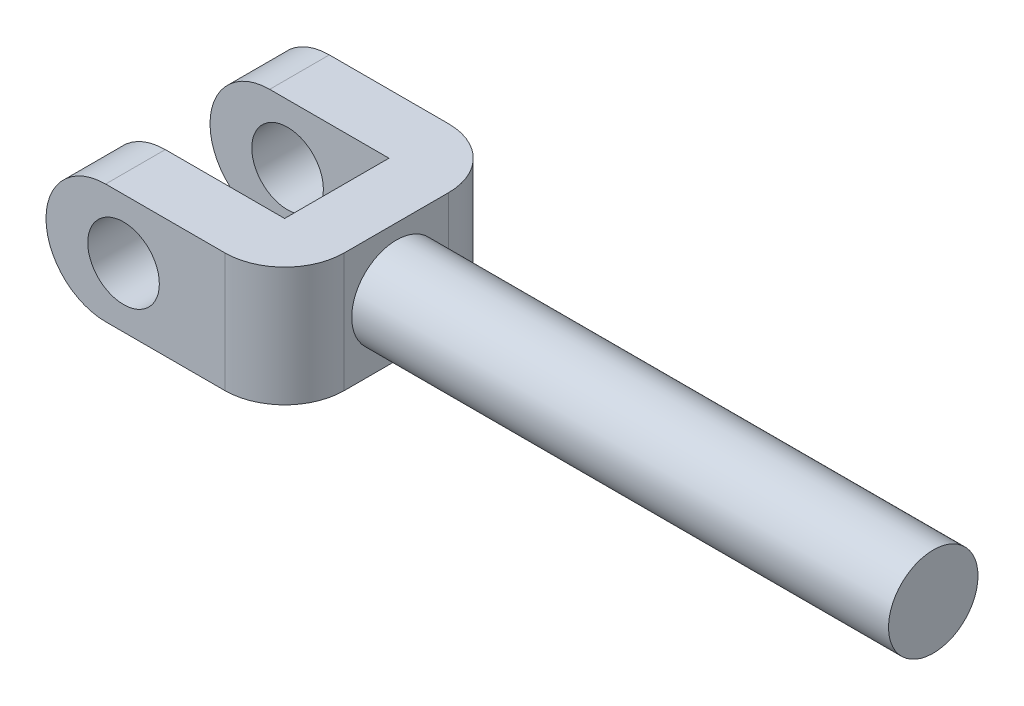
ISO-10303-21;
HEADER;
FILE_DESCRIPTION(('STEP AP214'),'2;1');
FILE_NAME('part.step','',(''),(''),'','','');
FILE_SCHEMA(('AUTOMOTIVE_DESIGN { 1 0 10303 214 1 1 1 1 }'));
ENDSEC;
DATA;
#1=APPLICATION_CONTEXT('core data for automotive mechanical design processes');
#2=APPLICATION_PROTOCOL_DEFINITION('international standard','automotive_design',2000,#1);
#3=PRODUCT_CONTEXT('',#1,'mechanical');
#4=PRODUCT('Part','Part','',(#3));
#5=PRODUCT_RELATED_PRODUCT_CATEGORY('part','',(#4));
#6=PRODUCT_DEFINITION_FORMATION('','',#4);
#7=PRODUCT_DEFINITION_CONTEXT('part definition',#1,'design');
#8=PRODUCT_DEFINITION('design','',#6,#7);
#9=PRODUCT_DEFINITION_SHAPE('','',#8);
#10=(LENGTH_UNIT() NAMED_UNIT(*) SI_UNIT(.MILLI.,.METRE.));
#11=(NAMED_UNIT(*) PLANE_ANGLE_UNIT() SI_UNIT($,.RADIAN.));
#12=(NAMED_UNIT(*) SI_UNIT($,.STERADIAN.) SOLID_ANGLE_UNIT());
#13=UNCERTAINTY_MEASURE_WITH_UNIT(LENGTH_MEASURE(1.E-05),#10,'distance_accuracy_value','');
#14=(GEOMETRIC_REPRESENTATION_CONTEXT(3) GLOBAL_UNCERTAINTY_ASSIGNED_CONTEXT((#13)) GLOBAL_UNIT_ASSIGNED_CONTEXT((#10,
#11,#12)) REPRESENTATION_CONTEXT('',''));
#15=CARTESIAN_POINT('',(0.,0.,0.));
#16=DIRECTION('',(0.,0.,1.));
#17=DIRECTION('',(1.,0.,0.));
#18=AXIS2_PLACEMENT_3D('',#15,#16,#17);
#19=CARTESIAN_POINT('',(10.,0.,0.));
#20=DIRECTION('',(-1.,0.,0.));
#21=DIRECTION('',(0.,0.,1.));
#22=AXIS2_PLACEMENT_3D('',#19,#20,#21);
#23=CYLINDRICAL_SURFACE('',#22,0.75);
#24=CARTESIAN_POINT('',(0.999999999999999,0.,0.));
#25=DIRECTION('',(1.,0.,0.));
#26=DIRECTION('',(0.,0.,-1.));
#27=AXIS2_PLACEMENT_3D('',#24,#25,#26);
#28=CIRCLE('',#27,0.75);
#29=CARTESIAN_POINT('',(0.999999999999999,0.,-0.75));
#30=VERTEX_POINT('',#29);
#31=EDGE_CURVE('E202',#30,#30,#28,.T.);
#32=ORIENTED_EDGE('',*,*,#31,.T.);
#33=EDGE_LOOP('',(#32));
#34=FACE_BOUND('',#33,.T.);
#35=CARTESIAN_POINT('',(10.,0.,0.));
#36=DIRECTION('',(1.,0.,0.));
#37=DIRECTION('',(0.,0.,-1.));
#38=AXIS2_PLACEMENT_3D('',#35,#36,#37);
#39=CIRCLE('',#38,0.75);
#40=CARTESIAN_POINT('',(10.,0.,-0.75));
#41=VERTEX_POINT('',#40);
#42=EDGE_CURVE('E204',#41,#41,#39,.T.);
#43=ORIENTED_EDGE('',*,*,#42,.F.);
#44=EDGE_LOOP('',(#43));
#45=FACE_BOUND('',#44,.T.);
#46=ADVANCED_FACE('F43',(#34,#45),#23,.T.);
#47=CARTESIAN_POINT('',(10.,0.,0.));
#48=DIRECTION('',(1.,0.,0.));
#49=DIRECTION('',(0.,0.,-1.));
#50=AXIS2_PLACEMENT_3D('',#47,#48,#49);
#51=PLANE('',#50);
#52=ORIENTED_EDGE('',*,*,#42,.T.);
#53=EDGE_LOOP('',(#52));
#54=FACE_BOUND('',#53,.T.);
#55=ADVANCED_FACE('F341',(#54),#51,.T.);
#56=CARTESIAN_POINT('',(0.,-1.,-0.875));
#57=DIRECTION('',(0.,0.,1.));
#58=DIRECTION('',(1.,0.,0.));
#59=AXIS2_PLACEMENT_3D('',#56,#57,#58);
#60=PLANE('',#59);
#61=CARTESIAN_POINT('',(-1.7,0.,-0.875));
#62=DIRECTION('',(0.,0.,1.));
#63=DIRECTION('',(1.,0.,0.));
#64=AXIS2_PLACEMENT_3D('',#61,#62,#63);
#65=CIRCLE('',#64,0.599999999999999);
#66=CARTESIAN_POINT('',(-1.1,0.,-0.875));
#67=VERTEX_POINT('',#66);
#68=EDGE_CURVE('E271',#67,#67,#65,.T.);
#69=ORIENTED_EDGE('',*,*,#68,.F.);
#70=EDGE_LOOP('',(#69));
#71=FACE_BOUND('',#70,.T.);
#72=DIRECTION('',(1.,0.,0.));
#73=VECTOR('',#72,1.);
#74=CARTESIAN_POINT('',(0.,1.,-0.875));
#75=LINE('',#74,#73);
#76=CARTESIAN_POINT('',(-2.,1.,-0.875));
#77=VERTEX_POINT('',#76);
#78=CARTESIAN_POINT('',(0.,1.,-0.875));
#79=VERTEX_POINT('',#78);
#80=EDGE_CURVE('E137',#77,#79,#75,.T.);
#81=ORIENTED_EDGE('',*,*,#80,.F.);
#82=CARTESIAN_POINT('',(-2.,0.,-0.875));
#83=DIRECTION('',(0.,0.,1.));
#84=DIRECTION('',(1.,0.,0.));
#85=AXIS2_PLACEMENT_3D('',#82,#83,#84);
#86=CIRCLE('',#85,1.);
#87=CARTESIAN_POINT('',(-3.,0.,-0.875));
#88=VERTEX_POINT('',#87);
#89=EDGE_CURVE('E225',#77,#88,#86,.T.);
#90=ORIENTED_EDGE('',*,*,#89,.T.);
#91=CARTESIAN_POINT('',(-2.,0.,-0.875));
#92=DIRECTION('',(0.,0.,1.));
#93=DIRECTION('',(1.,0.,0.));
#94=AXIS2_PLACEMENT_3D('',#91,#92,#93);
#95=CIRCLE('',#94,1.);
#96=CARTESIAN_POINT('',(-2.,-1.,-0.875));
#97=VERTEX_POINT('',#96);
#98=EDGE_CURVE('E222',#88,#97,#95,.T.);
#99=ORIENTED_EDGE('',*,*,#98,.T.);
#100=DIRECTION('',(1.,0.,0.));
#101=VECTOR('',#100,1.);
#102=CARTESIAN_POINT('',(0.,-1.,-0.875));
#103=LINE('',#102,#101);
#104=CARTESIAN_POINT('',(0.,-1.,-0.875));
#105=VERTEX_POINT('',#104);
#106=EDGE_CURVE('E155',#97,#105,#103,.T.);
#107=ORIENTED_EDGE('',*,*,#106,.T.);
#108=DIRECTION('',(0.,1.,0.));
#109=VECTOR('',#108,1.);
#110=CARTESIAN_POINT('',(0.,-1.,-0.875));
#111=LINE('',#110,#109);
#112=EDGE_CURVE('E152',#105,#79,#111,.T.);
#113=ORIENTED_EDGE('',*,*,#112,.T.);
#114=EDGE_LOOP('',(#81,#90,#99,#107,#113));
#115=FACE_BOUND('',#114,.T.);
#116=ADVANCED_FACE('F153',(#71,#115),#60,.T.);
#117=CARTESIAN_POINT('',(1.,-1.,-1.875));
#118=DIRECTION('',(0.,0.,-1.));
#119=DIRECTION('',(-1.,0.,0.));
#120=AXIS2_PLACEMENT_3D('',#117,#118,#119);
#121=PLANE('',#120);
#122=CARTESIAN_POINT('',(-1.7,0.,-1.875));
#123=DIRECTION('',(0.,0.,-1.));
#124=DIRECTION('',(-1.,0.,0.));
#125=AXIS2_PLACEMENT_3D('',#122,#123,#124);
#126=CIRCLE('',#125,0.599999999999999);
#127=CARTESIAN_POINT('',(-2.3,0.,-1.875));
#128=VERTEX_POINT('',#127);
#129=EDGE_CURVE('E283',#128,#128,#126,.T.);
#130=ORIENTED_EDGE('',*,*,#129,.F.);
#131=EDGE_LOOP('',(#130));
#132=FACE_BOUND('',#131,.T.);
#133=CARTESIAN_POINT('',(-2.,0.,-1.875));
#134=DIRECTION('',(0.,0.,-1.));
#135=DIRECTION('',(-1.,0.,0.));
#136=AXIS2_PLACEMENT_3D('',#133,#134,#135);
#137=CIRCLE('',#136,1.);
#138=CARTESIAN_POINT('',(-2.,-1.,-1.875));
#139=VERTEX_POINT('',#138);
#140=CARTESIAN_POINT('',(-3.,0.,-1.875));
#141=VERTEX_POINT('',#140);
#142=EDGE_CURVE('E231',#139,#141,#137,.T.);
#143=ORIENTED_EDGE('',*,*,#142,.T.);
#144=CARTESIAN_POINT('',(-2.,0.,-1.875));
#145=DIRECTION('',(0.,0.,-1.));
#146=DIRECTION('',(-1.,0.,0.));
#147=AXIS2_PLACEMENT_3D('',#144,#145,#146);
#148=CIRCLE('',#147,1.);
#149=CARTESIAN_POINT('',(-2.,1.,-1.875));
#150=VERTEX_POINT('',#149);
#151=EDGE_CURVE('E234',#141,#150,#148,.T.);
#152=ORIENTED_EDGE('',*,*,#151,.T.);
#153=DIRECTION('',(-1.,0.,0.));
#154=VECTOR('',#153,1.);
#155=CARTESIAN_POINT('',(1.,1.,-1.875));
#156=LINE('',#155,#154);
#157=CARTESIAN_POINT('',(0.,1.,-1.875));
#158=VERTEX_POINT('',#157);
#159=EDGE_CURVE('E179',#158,#150,#156,.T.);
#160=ORIENTED_EDGE('',*,*,#159,.F.);
#161=DIRECTION('',(0.,1.,0.));
#162=VECTOR('',#161,1.);
#163=CARTESIAN_POINT('',(0.,-1.,-1.875));
#164=LINE('',#163,#162);
#165=CARTESIAN_POINT('',(0.,-1.,-1.875));
#166=VERTEX_POINT('',#165);
#167=EDGE_CURVE('E228',#158,#166,#164,.F.);
#168=ORIENTED_EDGE('',*,*,#167,.T.);
#169=DIRECTION('',(-1.,0.,0.));
#170=VECTOR('',#169,1.);
#171=CARTESIAN_POINT('',(1.,-1.,-1.875));
#172=LINE('',#171,#170);
#173=EDGE_CURVE('E161',#166,#139,#172,.T.);
#174=ORIENTED_EDGE('',*,*,#173,.T.);
#175=EDGE_LOOP('',(#143,#152,#160,#168,#174));
#176=FACE_BOUND('',#175,.T.);
#177=ADVANCED_FACE('F319',(#132,#176),#121,.T.);
#178=CARTESIAN_POINT('',(1.,-1.,-1.875));
#179=DIRECTION('',(1.,0.,0.));
#180=DIRECTION('',(0.,0.,-1.));
#181=AXIS2_PLACEMENT_3D('',#178,#179,#180);
#182=PLANE('',#181);
#183=ORIENTED_EDGE('',*,*,#31,.F.);
#184=EDGE_LOOP('',(#183));
#185=FACE_BOUND('',#184,.T.);
#186=DIRECTION('',(0.,0.,-1.));
#187=VECTOR('',#186,1.);
#188=CARTESIAN_POINT('',(1.,-1.,-1.875));
#189=LINE('',#188,#187);
#190=CARTESIAN_POINT('',(1.,-1.,0.874999999999999));
#191=VERTEX_POINT('',#190);
#192=CARTESIAN_POINT('',(1.,-1.,-0.875000000000001));
#193=VERTEX_POINT('',#192);
#194=EDGE_CURVE('E194',#191,#193,#189,.T.);
#195=ORIENTED_EDGE('',*,*,#194,.T.);
#196=DIRECTION('',(0.,1.,0.));
#197=VECTOR('',#196,1.);
#198=CARTESIAN_POINT('',(1.,-1.,-0.875));
#199=LINE('',#198,#197);
#200=CARTESIAN_POINT('',(1.,1.,-0.875000000000001));
#201=VERTEX_POINT('',#200);
#202=EDGE_CURVE('E11',#193,#201,#199,.T.);
#203=ORIENTED_EDGE('',*,*,#202,.T.);
#204=DIRECTION('',(0.,0.,-1.));
#205=VECTOR('',#204,1.);
#206=CARTESIAN_POINT('',(1.,1.,-1.875));
#207=LINE('',#206,#205);
#208=CARTESIAN_POINT('',(1.,1.,0.874999999999999));
#209=VERTEX_POINT('',#208);
#210=EDGE_CURVE('E175',#209,#201,#207,.T.);
#211=ORIENTED_EDGE('',*,*,#210,.F.);
#212=DIRECTION('',(0.,1.,0.));
#213=VECTOR('',#212,1.);
#214=CARTESIAN_POINT('',(1.,-1.,0.875));
#215=LINE('',#214,#213);
#216=EDGE_CURVE('E53',#209,#191,#215,.F.);
#217=ORIENTED_EDGE('',*,*,#216,.T.);
#218=EDGE_LOOP('',(#195,#203,#211,#217));
#219=FACE_BOUND('',#218,.T.);
#220=ADVANCED_FACE('F310',(#185,#219),#182,.T.);
#221=CARTESIAN_POINT('',(1.,-1.,1.875));
#222=DIRECTION('',(0.,0.,1.));
#223=DIRECTION('',(1.,0.,0.));
#224=AXIS2_PLACEMENT_3D('',#221,#222,#223);
#225=PLANE('',#224);
#226=CARTESIAN_POINT('',(-1.7,0.,1.875));
#227=DIRECTION('',(0.,0.,1.));
#228=DIRECTION('',(1.,0.,0.));
#229=AXIS2_PLACEMENT_3D('',#226,#227,#228);
#230=CIRCLE('',#229,0.599999999999999);
#231=CARTESIAN_POINT('',(-1.1,0.,1.875));
#232=VERTEX_POINT('',#231);
#233=EDGE_CURVE('E276',#232,#232,#230,.T.);
#234=ORIENTED_EDGE('',*,*,#233,.F.);
#235=EDGE_LOOP('',(#234));
#236=FACE_BOUND('',#235,.T.);
#237=CARTESIAN_POINT('',(-2.,0.,1.875));
#238=DIRECTION('',(0.,0.,1.));
#239=DIRECTION('',(1.,0.,0.));
#240=AXIS2_PLACEMENT_3D('',#237,#238,#239);
#241=CIRCLE('',#240,1.);
#242=CARTESIAN_POINT('',(-2.,1.,1.875));
#243=VERTEX_POINT('',#242);
#244=CARTESIAN_POINT('',(-3.,0.,1.875));
#245=VERTEX_POINT('',#244);
#246=EDGE_CURVE('E69',#243,#245,#241,.T.);
#247=ORIENTED_EDGE('',*,*,#246,.T.);
#248=CARTESIAN_POINT('',(-2.,0.,1.875));
#249=DIRECTION('',(0.,0.,1.));
#250=DIRECTION('',(1.,0.,0.));
#251=AXIS2_PLACEMENT_3D('',#248,#249,#250);
#252=CIRCLE('',#251,1.);
#253=CARTESIAN_POINT('',(-2.,-1.,1.875));
#254=VERTEX_POINT('',#253);
#255=EDGE_CURVE('E256',#245,#254,#252,.T.);
#256=ORIENTED_EDGE('',*,*,#255,.T.);
#257=DIRECTION('',(1.,0.,0.));
#258=VECTOR('',#257,1.);
#259=CARTESIAN_POINT('',(1.,-1.,1.875));
#260=LINE('',#259,#258);
#261=CARTESIAN_POINT('',(0.,-1.,1.875));
#262=VERTEX_POINT('',#261);
#263=EDGE_CURVE('E190',#254,#262,#260,.T.);
#264=ORIENTED_EDGE('',*,*,#263,.T.);
#265=DIRECTION('',(0.,1.,0.));
#266=VECTOR('',#265,1.);
#267=CARTESIAN_POINT('',(0.,-1.,1.875));
#268=LINE('',#267,#266);
#269=CARTESIAN_POINT('',(0.,1.,1.875));
#270=VERTEX_POINT('',#269);
#271=EDGE_CURVE('E250',#262,#270,#268,.T.);
#272=ORIENTED_EDGE('',*,*,#271,.T.);
#273=DIRECTION('',(1.,0.,0.));
#274=VECTOR('',#273,1.);
#275=CARTESIAN_POINT('',(1.,1.,1.875));
#276=LINE('',#275,#274);
#277=EDGE_CURVE('E168',#243,#270,#276,.T.);
#278=ORIENTED_EDGE('',*,*,#277,.F.);
#279=EDGE_LOOP('',(#247,#256,#264,#272,#278));
#280=FACE_BOUND('',#279,.T.);
#281=ADVANCED_FACE('F297',(#236,#280),#225,.T.);
#282=CARTESIAN_POINT('',(-3.,-1.,0.875));
#283=DIRECTION('',(0.,0.,-1.));
#284=DIRECTION('',(-1.,0.,0.));
#285=AXIS2_PLACEMENT_3D('',#282,#283,#284);
#286=PLANE('',#285);
#287=CARTESIAN_POINT('',(-1.7,0.,0.875));
#288=DIRECTION('',(0.,0.,-1.));
#289=DIRECTION('',(-1.,0.,0.));
#290=AXIS2_PLACEMENT_3D('',#287,#288,#289);
#291=CIRCLE('',#290,0.599999999999999);
#292=CARTESIAN_POINT('',(-2.3,0.,0.875));
#293=VERTEX_POINT('',#292);
#294=EDGE_CURVE('E47',#293,#293,#291,.T.);
#295=ORIENTED_EDGE('',*,*,#294,.F.);
#296=EDGE_LOOP('',(#295));
#297=FACE_BOUND('',#296,.T.);
#298=DIRECTION('',(-1.,0.,0.));
#299=VECTOR('',#298,1.);
#300=CARTESIAN_POINT('',(-3.,-1.,0.875));
#301=LINE('',#300,#299);
#302=CARTESIAN_POINT('',(0.,-1.,0.875));
#303=VERTEX_POINT('',#302);
#304=CARTESIAN_POINT('',(-2.,-1.,0.875));
#305=VERTEX_POINT('',#304);
#306=EDGE_CURVE('E187',#303,#305,#301,.T.);
#307=ORIENTED_EDGE('',*,*,#306,.T.);
#308=CARTESIAN_POINT('',(-2.,0.,0.875));
#309=DIRECTION('',(0.,0.,-1.));
#310=DIRECTION('',(-1.,0.,0.));
#311=AXIS2_PLACEMENT_3D('',#308,#309,#310);
#312=CIRCLE('',#311,1.);
#313=CARTESIAN_POINT('',(-3.,0.,0.875));
#314=VERTEX_POINT('',#313);
#315=EDGE_CURVE('E61',#305,#314,#312,.T.);
#316=ORIENTED_EDGE('',*,*,#315,.T.);
#317=CARTESIAN_POINT('',(-2.,0.,0.875));
#318=DIRECTION('',(0.,0.,-1.));
#319=DIRECTION('',(-1.,0.,0.));
#320=AXIS2_PLACEMENT_3D('',#317,#318,#319);
#321=CIRCLE('',#320,1.);
#322=CARTESIAN_POINT('',(-2.,1.,0.875));
#323=VERTEX_POINT('',#322);
#324=EDGE_CURVE('E259',#314,#323,#321,.T.);
#325=ORIENTED_EDGE('',*,*,#324,.T.);
#326=DIRECTION('',(-1.,0.,0.));
#327=VECTOR('',#326,1.);
#328=CARTESIAN_POINT('',(-3.,1.,0.875));
#329=LINE('',#328,#327);
#330=CARTESIAN_POINT('',(0.,1.,0.875));
#331=VERTEX_POINT('',#330);
#332=EDGE_CURVE('E165',#331,#323,#329,.T.);
#333=ORIENTED_EDGE('',*,*,#332,.F.);
#334=DIRECTION('',(0.,1.,0.));
#335=VECTOR('',#334,1.);
#336=CARTESIAN_POINT('',(0.,-1.,0.875));
#337=LINE('',#336,#335);
#338=EDGE_CURVE('E160',#303,#331,#337,.T.);
#339=ORIENTED_EDGE('',*,*,#338,.F.);
#340=EDGE_LOOP('',(#307,#316,#325,#333,#339));
#341=FACE_BOUND('',#340,.T.);
#342=ADVANCED_FACE('F294',(#297,#341),#286,.T.);
#343=CARTESIAN_POINT('',(0.,-1.,0.));
#344=DIRECTION('',(0.,1.,0.));
#345=DIRECTION('',(0.,0.,1.));
#346=AXIS2_PLACEMENT_3D('',#343,#344,#345);
#347=PLANE('',#346);
#348=ORIENTED_EDGE('',*,*,#106,.F.);
#349=DIRECTION('',(0.,0.,1.));
#350=VECTOR('',#349,1.);
#351=CARTESIAN_POINT('',(-2.,-1.,-1.875));
#352=LINE('',#351,#350);
#353=EDGE_CURVE('E247',#97,#139,#352,.F.);
#354=ORIENTED_EDGE('',*,*,#353,.T.);
#355=ORIENTED_EDGE('',*,*,#173,.F.);
#356=CARTESIAN_POINT('',(0.,-1.,-0.875));
#357=DIRECTION('',(0.,1.,0.));
#358=DIRECTION('',(0.,0.,1.));
#359=AXIS2_PLACEMENT_3D('',#356,#357,#358);
#360=CIRCLE('',#359,1.);
#361=EDGE_CURVE('E240',#166,#193,#360,.F.);
#362=ORIENTED_EDGE('',*,*,#361,.T.);
#363=ORIENTED_EDGE('',*,*,#194,.F.);
#364=CARTESIAN_POINT('',(0.,-1.,0.875));
#365=DIRECTION('',(0.,1.,0.));
#366=DIRECTION('',(0.,0.,1.));
#367=AXIS2_PLACEMENT_3D('',#364,#365,#366);
#368=CIRCLE('',#367,1.);
#369=EDGE_CURVE('E237',#191,#262,#368,.F.);
#370=ORIENTED_EDGE('',*,*,#369,.T.);
#371=ORIENTED_EDGE('',*,*,#263,.F.);
#372=DIRECTION('',(0.,0.,1.));
#373=VECTOR('',#372,1.);
#374=CARTESIAN_POINT('',(-2.,-1.,0.875));
#375=LINE('',#374,#373);
#376=EDGE_CURVE('E243',#254,#305,#375,.F.);
#377=ORIENTED_EDGE('',*,*,#376,.T.);
#378=ORIENTED_EDGE('',*,*,#306,.F.);
#379=DIRECTION('',(0.,0.,1.));
#380=VECTOR('',#379,1.);
#381=CARTESIAN_POINT('',(0.,-1.,-0.875));
#382=LINE('',#381,#380);
#383=EDGE_CURVE('E184',#105,#303,#382,.T.);
#384=ORIENTED_EDGE('',*,*,#383,.F.);
#385=EDGE_LOOP('',(#348,#354,#355,#362,#363,#370,#371,#377,#378,#384));
#386=FACE_BOUND('',#385,.T.);
#387=ADVANCED_FACE('F296',(#386),#347,.F.);
#388=CARTESIAN_POINT('',(0.,1.,0.));
#389=DIRECTION('',(0.,1.,0.));
#390=DIRECTION('',(0.,0.,1.));
#391=AXIS2_PLACEMENT_3D('',#388,#389,#390);
#392=PLANE('',#391);
#393=ORIENTED_EDGE('',*,*,#159,.T.);
#394=DIRECTION('',(0.,0.,1.));
#395=VECTOR('',#394,1.);
#396=CARTESIAN_POINT('',(-2.,1.,0.));
#397=LINE('',#396,#395);
#398=EDGE_CURVE('E146',#150,#77,#397,.T.);
#399=ORIENTED_EDGE('',*,*,#398,.T.);
#400=ORIENTED_EDGE('',*,*,#80,.T.);
#401=DIRECTION('',(0.,0.,1.));
#402=VECTOR('',#401,1.);
#403=CARTESIAN_POINT('',(0.,1.,-0.875));
#404=LINE('',#403,#402);
#405=EDGE_CURVE('E143',#79,#331,#404,.T.);
#406=ORIENTED_EDGE('',*,*,#405,.T.);
#407=ORIENTED_EDGE('',*,*,#332,.T.);
#408=DIRECTION('',(0.,0.,1.));
#409=VECTOR('',#408,1.);
#410=CARTESIAN_POINT('',(-2.,1.,0.));
#411=LINE('',#410,#409);
#412=EDGE_CURVE('E217',#323,#243,#411,.T.);
#413=ORIENTED_EDGE('',*,*,#412,.T.);
#414=ORIENTED_EDGE('',*,*,#277,.T.);
#415=CARTESIAN_POINT('',(0.,1.,0.875));
#416=DIRECTION('',(0.,1.,0.));
#417=DIRECTION('',(0.,0.,1.));
#418=AXIS2_PLACEMENT_3D('',#415,#416,#417);
#419=CIRCLE('',#418,1.);
#420=EDGE_CURVE('E208',#270,#209,#419,.T.);
#421=ORIENTED_EDGE('',*,*,#420,.T.);
#422=ORIENTED_EDGE('',*,*,#210,.T.);
#423=CARTESIAN_POINT('',(0.,1.,-0.875));
#424=DIRECTION('',(0.,1.,0.));
#425=DIRECTION('',(0.,0.,1.));
#426=AXIS2_PLACEMENT_3D('',#423,#424,#425);
#427=CIRCLE('',#426,1.);
#428=EDGE_CURVE('E214',#201,#158,#427,.T.);
#429=ORIENTED_EDGE('',*,*,#428,.T.);
#430=EDGE_LOOP('',(#393,#399,#400,#406,#407,#413,#414,#421,#422,#429));
#431=FACE_BOUND('',#430,.T.);
#432=ADVANCED_FACE('F140',(#431),#392,.T.);
#433=CARTESIAN_POINT('',(0.,0.,0.));
#434=DIRECTION('',(1.,0.,0.));
#435=DIRECTION('',(0.,0.,-1.));
#436=AXIS2_PLACEMENT_3D('',#433,#434,#435);
#437=PLANE('',#436);
#438=ORIENTED_EDGE('',*,*,#338,.T.);
#439=ORIENTED_EDGE('',*,*,#405,.F.);
#440=ORIENTED_EDGE('',*,*,#112,.F.);
#441=ORIENTED_EDGE('',*,*,#383,.T.);
#442=EDGE_LOOP('',(#438,#439,#440,#441));
#443=FACE_BOUND('',#442,.T.);
#444=ADVANCED_FACE('F163',(#443),#437,.F.);
#445=CARTESIAN_POINT('',(-2.,0.,-1.875));
#446=DIRECTION('',(0.,0.,-1.));
#447=DIRECTION('',(-1.,0.,0.));
#448=AXIS2_PLACEMENT_3D('',#445,#446,#447);
#449=CYLINDRICAL_SURFACE('',#448,1.);
#450=DIRECTION('',(0.,0.,1.));
#451=VECTOR('',#450,1.);
#452=CARTESIAN_POINT('',(-3.,0.,-0.875));
#453=LINE('',#452,#451);
#454=EDGE_CURVE('E149',#141,#88,#453,.T.);
#455=ORIENTED_EDGE('',*,*,#454,.F.);
#456=ORIENTED_EDGE('',*,*,#142,.F.);
#457=ORIENTED_EDGE('',*,*,#353,.F.);
#458=ORIENTED_EDGE('',*,*,#98,.F.);
#459=EDGE_LOOP('',(#455,#456,#457,#458));
#460=FACE_BOUND('',#459,.T.);
#461=ADVANCED_FACE('F329',(#460),#449,.T.);
#462=CARTESIAN_POINT('',(-2.,0.,0.));
#463=DIRECTION('',(0.,0.,1.));
#464=DIRECTION('',(1.,0.,0.));
#465=AXIS2_PLACEMENT_3D('',#462,#463,#464);
#466=CYLINDRICAL_SURFACE('',#465,1.);
#467=ORIENTED_EDGE('',*,*,#151,.F.);
#468=ORIENTED_EDGE('',*,*,#454,.T.);
#469=ORIENTED_EDGE('',*,*,#89,.F.);
#470=ORIENTED_EDGE('',*,*,#398,.F.);
#471=EDGE_LOOP('',(#467,#468,#469,#470));
#472=FACE_BOUND('',#471,.T.);
#473=ADVANCED_FACE('F325',(#472),#466,.T.);
#474=CARTESIAN_POINT('',(-2.,0.,0.));
#475=DIRECTION('',(0.,0.,1.));
#476=DIRECTION('',(1.,0.,0.));
#477=AXIS2_PLACEMENT_3D('',#474,#475,#476);
#478=CYLINDRICAL_SURFACE('',#477,1.);
#479=ORIENTED_EDGE('',*,*,#412,.F.);
#480=ORIENTED_EDGE('',*,*,#324,.F.);
#481=DIRECTION('',(0.,0.,1.));
#482=VECTOR('',#481,1.);
#483=CARTESIAN_POINT('',(-3.,0.,0.875));
#484=LINE('',#483,#482);
#485=EDGE_CURVE('E268',#245,#314,#484,.F.);
#486=ORIENTED_EDGE('',*,*,#485,.F.);
#487=ORIENTED_EDGE('',*,*,#246,.F.);
#488=EDGE_LOOP('',(#479,#480,#486,#487));
#489=FACE_BOUND('',#488,.T.);
#490=ADVANCED_FACE('F336',(#489),#478,.T.);
#491=CARTESIAN_POINT('',(-2.,0.,0.875));
#492=DIRECTION('',(0.,0.,-1.));
#493=DIRECTION('',(-1.,0.,0.));
#494=AXIS2_PLACEMENT_3D('',#491,#492,#493);
#495=CYLINDRICAL_SURFACE('',#494,1.);
#496=ORIENTED_EDGE('',*,*,#315,.F.);
#497=ORIENTED_EDGE('',*,*,#376,.F.);
#498=ORIENTED_EDGE('',*,*,#255,.F.);
#499=ORIENTED_EDGE('',*,*,#485,.T.);
#500=EDGE_LOOP('',(#496,#497,#498,#499));
#501=FACE_BOUND('',#500,.T.);
#502=ADVANCED_FACE('F303',(#501),#495,.T.);
#503=CARTESIAN_POINT('',(0.,-1.,-0.875));
#504=DIRECTION('',(0.,1.,0.));
#505=DIRECTION('',(0.,0.,1.));
#506=AXIS2_PLACEMENT_3D('',#503,#504,#505);
#507=CYLINDRICAL_SURFACE('',#506,1.);
#508=ORIENTED_EDGE('',*,*,#361,.F.);
#509=ORIENTED_EDGE('',*,*,#167,.F.);
#510=ORIENTED_EDGE('',*,*,#428,.F.);
#511=ORIENTED_EDGE('',*,*,#202,.F.);
#512=EDGE_LOOP('',(#508,#509,#510,#511));
#513=FACE_BOUND('',#512,.T.);
#514=ADVANCED_FACE('F315',(#513),#507,.T.);
#515=CARTESIAN_POINT('',(0.,-1.,0.875));
#516=DIRECTION('',(0.,1.,0.));
#517=DIRECTION('',(0.,0.,1.));
#518=AXIS2_PLACEMENT_3D('',#515,#516,#517);
#519=CYLINDRICAL_SURFACE('',#518,1.);
#520=ORIENTED_EDGE('',*,*,#369,.F.);
#521=ORIENTED_EDGE('',*,*,#216,.F.);
#522=ORIENTED_EDGE('',*,*,#420,.F.);
#523=ORIENTED_EDGE('',*,*,#271,.F.);
#524=EDGE_LOOP('',(#520,#521,#522,#523));
#525=FACE_BOUND('',#524,.T.);
#526=ADVANCED_FACE('F45',(#525),#519,.T.);
#527=CARTESIAN_POINT('',(-1.7,0.,3.125));
#528=DIRECTION('',(0.,0.,-1.));
#529=DIRECTION('',(-1.,0.,0.));
#530=AXIS2_PLACEMENT_3D('',#527,#528,#529);
#531=CYLINDRICAL_SURFACE('',#530,0.599999999999999);
#532=ORIENTED_EDGE('',*,*,#233,.T.);
#533=EDGE_LOOP('',(#532));
#534=FACE_BOUND('',#533,.T.);
#535=ORIENTED_EDGE('',*,*,#294,.T.);
#536=EDGE_LOOP('',(#535));
#537=FACE_BOUND('',#536,.T.);
#538=ADVANCED_FACE('F292',(#534,#537),#531,.F.);
#539=ORIENTED_EDGE('',*,*,#68,.T.);
#540=EDGE_LOOP('',(#539));
#541=FACE_BOUND('',#540,.T.);
#542=ORIENTED_EDGE('',*,*,#129,.T.);
#543=EDGE_LOOP('',(#542));
#544=FACE_BOUND('',#543,.T.);
#545=ADVANCED_FACE('F368',(#541,#544),#531,.F.);
#546=CLOSED_SHELL('',(#46,#55,#116,#177,#220,#281,#342,#387,#432,#444,#461,#473,#490,#502,#514,
#526,#538,#545));
#547=MANIFOLD_SOLID_BREP('B2',#546);
#548=ADVANCED_BREP_SHAPE_REPRESENTATION('',(#18,#547),#14);
#549=SHAPE_DEFINITION_REPRESENTATION(#9,#548);
ENDSEC;
END-ISO-10303-21;
